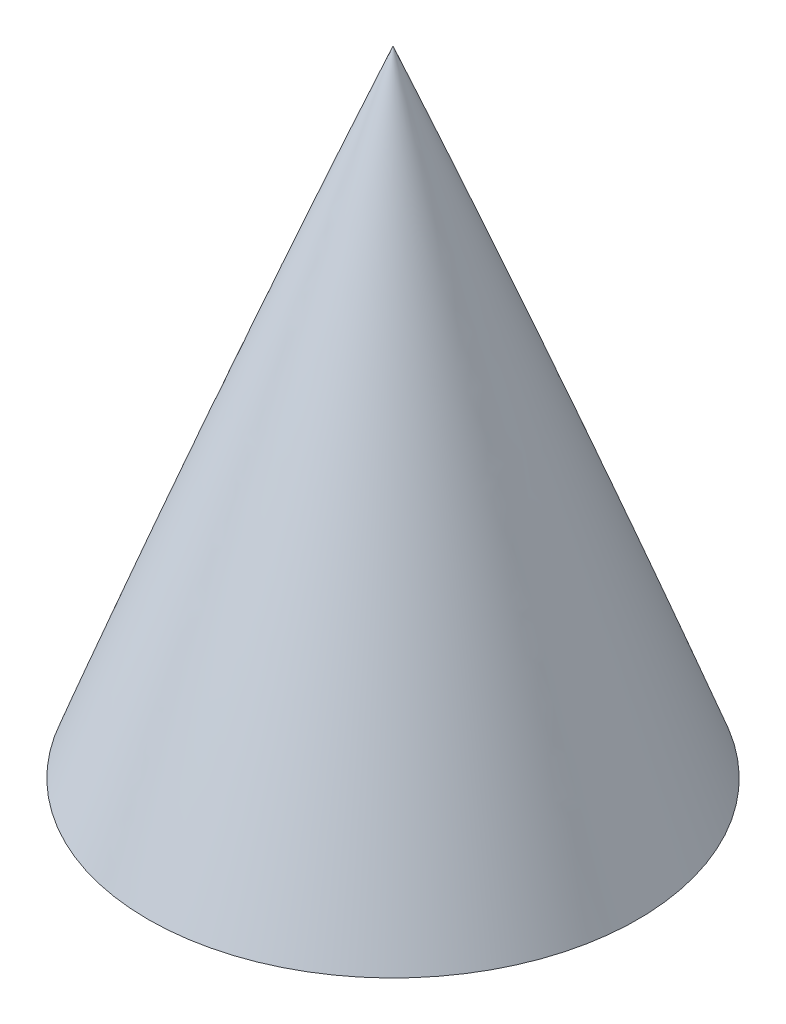
ISO-10303-21;
HEADER;
FILE_DESCRIPTION(('STEP AP214'),'2;1');
FILE_NAME('part.step','',(''),(''),'','','');
FILE_SCHEMA(('AUTOMOTIVE_DESIGN { 1 0 10303 214 1 1 1 1 }'));
ENDSEC;
DATA;
#1=APPLICATION_CONTEXT('core data for automotive mechanical design processes');
#2=APPLICATION_PROTOCOL_DEFINITION('international standard','automotive_design',2000,#1);
#3=PRODUCT_CONTEXT('',#1,'mechanical');
#4=PRODUCT('Part','Part','',(#3));
#5=PRODUCT_RELATED_PRODUCT_CATEGORY('part','',(#4));
#6=PRODUCT_DEFINITION_FORMATION('','',#4);
#7=PRODUCT_DEFINITION_CONTEXT('part definition',#1,'design');
#8=PRODUCT_DEFINITION('design','',#6,#7);
#9=PRODUCT_DEFINITION_SHAPE('','',#8);
#10=(LENGTH_UNIT() NAMED_UNIT(*) SI_UNIT(.MILLI.,.METRE.));
#11=(NAMED_UNIT(*) PLANE_ANGLE_UNIT() SI_UNIT($,.RADIAN.));
#12=(NAMED_UNIT(*) SI_UNIT($,.STERADIAN.) SOLID_ANGLE_UNIT());
#13=UNCERTAINTY_MEASURE_WITH_UNIT(LENGTH_MEASURE(1.E-05),#10,'distance_accuracy_value','');
#14=(GEOMETRIC_REPRESENTATION_CONTEXT(3) GLOBAL_UNCERTAINTY_ASSIGNED_CONTEXT((#13)) GLOBAL_UNIT_ASSIGNED_CONTEXT((#10,
#11,#12)) REPRESENTATION_CONTEXT('',''));
#15=CARTESIAN_POINT('',(0.,0.,0.));
#16=DIRECTION('',(0.,0.,1.));
#17=DIRECTION('',(1.,0.,0.));
#18=AXIS2_PLACEMENT_3D('',#15,#16,#17);
#19=CARTESIAN_POINT('',(0.,0.,-993.420310811265));
#20=DIRECTION('',(-1.,0.,0.));
#21=DIRECTION('',(0.,0.,1.));
#22=AXIS2_PLACEMENT_3D('',#19,#20,#21);
#23=CIRCLE('',#22,1069.62031081127);
#24=TRIMMED_CURVE('',#23,(PARAMETER_VALUE(-0.379743443275763)),
(PARAMETER_VALUE(0.379743443275763)),.T.,.PARAMETER.);
#25=CARTESIAN_POINT('',(0.,0.,0.));
#26=DIRECTION('',(0.,1.,0.));
#27=AXIS1_PLACEMENT('',#25,#26);
#28=SURFACE_OF_REVOLUTION('',#24,#27);
#29=CARTESIAN_POINT('',(-3.33066907387547E-13,396.489212170568,0.));
#30=VERTEX_POINT('',#29);
#31=VERTEX_LOOP('',#30);
#32=FACE_BOUND('',#31,.T.);
#33=CARTESIAN_POINT('',(0.,370.,0.));
#34=DIRECTION('',(0.,-1.,0.));
#35=DIRECTION('',(0.,0.,-1.));
#36=AXIS2_PLACEMENT_3D('',#33,#34,#35);
#37=CIRCLE('',#36,10.1670592268335);
#38=CARTESIAN_POINT('',(0.,370.,-10.1670592268335));
#39=VERTEX_POINT('',#38);
#40=EDGE_CURVE('E50',#39,#39,#37,.T.);
#41=ORIENTED_EDGE('',*,*,#40,.T.);
#42=EDGE_LOOP('',(#41));
#43=FACE_BOUND('',#42,.T.);
#44=ADVANCED_FACE('F46',(#32,#43),#28,.F.);
#45=CARTESIAN_POINT('',(0.,370.,0.));
#46=DIRECTION('',(0.,-1.,0.));
#47=DIRECTION('',(0.,0.,-1.));
#48=AXIS2_PLACEMENT_3D('',#45,#46,#47);
#49=PLANE('',#48);
#50=ORIENTED_EDGE('',*,*,#40,.F.);
#51=EDGE_LOOP('',(#50));
#52=FACE_BOUND('',#51,.T.);
#53=CARTESIAN_POINT('',(0.,370.,0.));
#54=DIRECTION('',(0.,-1.,0.));
#55=DIRECTION('',(0.,0.,-1.));
#56=AXIS2_PLACEMENT_3D('',#53,#54,#55);
#57=CIRCLE('',#56,12.2983827324279);
#58=CARTESIAN_POINT('',(0.,370.,-12.2983827324279));
#59=VERTEX_POINT('',#58);
#60=EDGE_CURVE('E12',#59,#59,#57,.T.);
#61=ORIENTED_EDGE('',*,*,#60,.T.);
#62=EDGE_LOOP('',(#61));
#63=FACE_BOUND('',#62,.T.);
#64=ADVANCED_FACE('F63',(#52,#63),#49,.T.);
#65=CARTESIAN_POINT('',(0.,0.,-993.420310811265));
#66=DIRECTION('',(-1.,0.,0.));
#67=DIRECTION('',(0.,0.,1.));
#68=AXIS2_PLACEMENT_3D('',#65,#66,#67);
#69=CIRCLE('',#68,1071.62031081127);
#70=TRIMMED_CURVE('',#69,(PARAMETER_VALUE(-0.384392556962875)),
(PARAMETER_VALUE(0.384392556962875)),.T.,.PARAMETER.);
#71=CARTESIAN_POINT('',(0.,0.,0.));
#72=DIRECTION('',(0.,1.,0.));
#73=AXIS1_PLACEMENT('',#71,#72);
#74=SURFACE_OF_REVOLUTION('',#70,#73);
#75=CARTESIAN_POINT('',(0.,401.853426775089,0.));
#76=VERTEX_POINT('',#75);
#77=VERTEX_LOOP('',#76);
#78=FACE_BOUND('',#77,.T.);
#79=ORIENTED_EDGE('',*,*,#60,.F.);
#80=EDGE_LOOP('',(#79));
#81=FACE_BOUND('',#80,.T.);
#82=ADVANCED_FACE('F48',(#78,#81),#74,.T.);
#83=CLOSED_SHELL('',(#44,#64,#82));
#84=MANIFOLD_SOLID_BREP('B2',#83);
#85=ADVANCED_BREP_SHAPE_REPRESENTATION('',(#18,#84),#14);
#86=SHAPE_DEFINITION_REPRESENTATION(#9,#85);
ENDSEC;
END-ISO-10303-21;
